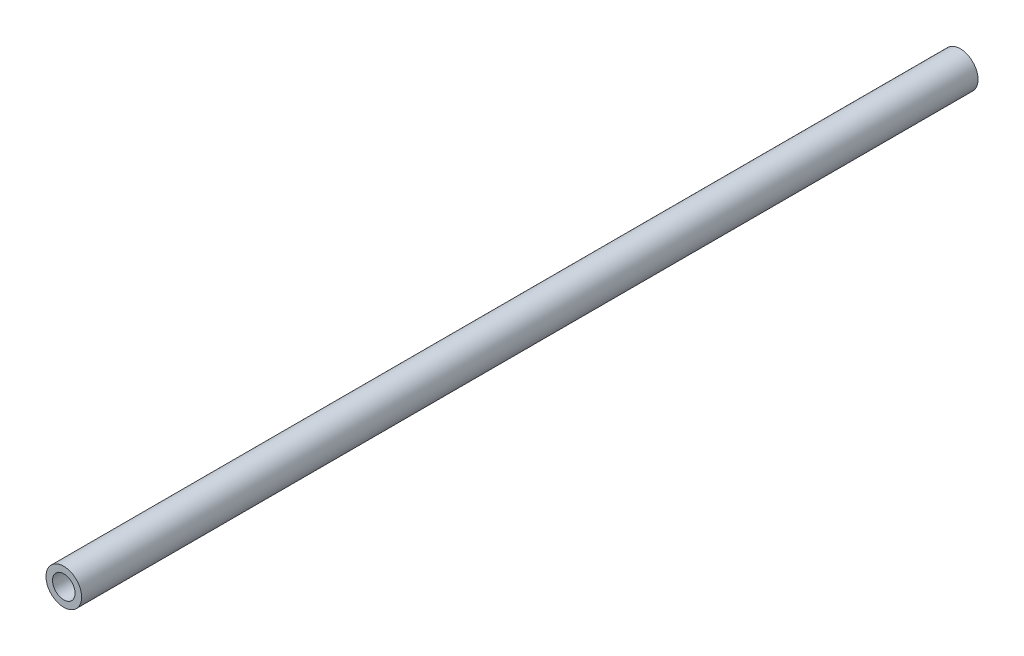
ISO-10303-21;
HEADER;
FILE_DESCRIPTION(('STEP AP214'),'2;1');
FILE_NAME('part.step','',(''),(''),'','','');
FILE_SCHEMA(('AUTOMOTIVE_DESIGN { 1 0 10303 214 1 1 1 1 }'));
ENDSEC;
DATA;
#1=APPLICATION_CONTEXT('core data for automotive mechanical design processes');
#2=APPLICATION_PROTOCOL_DEFINITION('international standard','automotive_design',2000,#1);
#3=PRODUCT_CONTEXT('',#1,'mechanical');
#4=PRODUCT('Part','Part','',(#3));
#5=PRODUCT_RELATED_PRODUCT_CATEGORY('part','',(#4));
#6=PRODUCT_DEFINITION_FORMATION('','',#4);
#7=PRODUCT_DEFINITION_CONTEXT('part definition',#1,'design');
#8=PRODUCT_DEFINITION('design','',#6,#7);
#9=PRODUCT_DEFINITION_SHAPE('','',#8);
#10=(LENGTH_UNIT() NAMED_UNIT(*) SI_UNIT(.MILLI.,.METRE.));
#11=(NAMED_UNIT(*) PLANE_ANGLE_UNIT() SI_UNIT($,.RADIAN.));
#12=(NAMED_UNIT(*) SI_UNIT($,.STERADIAN.) SOLID_ANGLE_UNIT());
#13=UNCERTAINTY_MEASURE_WITH_UNIT(LENGTH_MEASURE(1.E-05),#10,'distance_accuracy_value','');
#14=(GEOMETRIC_REPRESENTATION_CONTEXT(3) GLOBAL_UNCERTAINTY_ASSIGNED_CONTEXT((#13)) GLOBAL_UNIT_ASSIGNED_CONTEXT((#10,
#11,#12)) REPRESENTATION_CONTEXT('',''));
#15=CARTESIAN_POINT('',(0.,0.,0.));
#16=DIRECTION('',(0.,0.,1.));
#17=DIRECTION('',(1.,0.,0.));
#18=AXIS2_PLACEMENT_3D('',#15,#16,#17);
#19=CARTESIAN_POINT('',(0.,0.,120.));
#20=DIRECTION('',(0.,0.,1.));
#21=DIRECTION('',(1.,0.,0.));
#22=AXIS2_PLACEMENT_3D('',#19,#20,#21);
#23=PLANE('',#22);
#24=CARTESIAN_POINT('',(0.,0.,120.));
#25=DIRECTION('',(0.,0.,-1.));
#26=DIRECTION('',(-1.,0.,0.));
#27=AXIS2_PLACEMENT_3D('',#24,#25,#26);
#28=CIRCLE('',#27,1.5113);
#29=CARTESIAN_POINT('',(-1.5113,0.,120.));
#30=VERTEX_POINT('',#29);
#31=EDGE_CURVE('E11',#30,#30,#28,.T.);
#32=ORIENTED_EDGE('',*,*,#31,.T.);
#33=EDGE_LOOP('',(#32));
#34=FACE_BOUND('',#33,.T.);
#35=CARTESIAN_POINT('',(0.,0.,120.));
#36=DIRECTION('',(0.,0.,-1.));
#37=DIRECTION('',(-1.,0.,0.));
#38=AXIS2_PLACEMENT_3D('',#35,#36,#37);
#39=CIRCLE('',#38,2.38125);
#40=CARTESIAN_POINT('',(-2.38125,0.,120.));
#41=VERTEX_POINT('',#40);
#42=EDGE_CURVE('E51',#41,#41,#39,.T.);
#43=ORIENTED_EDGE('',*,*,#42,.F.);
#44=EDGE_LOOP('',(#43));
#45=FACE_BOUND('',#44,.T.);
#46=ADVANCED_FACE('F40',(#34,#45),#23,.T.);
#47=CARTESIAN_POINT('',(0.,0.,0.));
#48=DIRECTION('',(0.,0.,1.));
#49=DIRECTION('',(1.,0.,0.));
#50=AXIS2_PLACEMENT_3D('',#47,#48,#49);
#51=PLANE('',#50);
#52=CARTESIAN_POINT('',(0.,0.,0.));
#53=DIRECTION('',(0.,0.,-1.));
#54=DIRECTION('',(-1.,0.,0.));
#55=AXIS2_PLACEMENT_3D('',#52,#53,#54);
#56=CIRCLE('',#55,1.5113);
#57=CARTESIAN_POINT('',(-1.5113,0.,0.));
#58=VERTEX_POINT('',#57);
#59=EDGE_CURVE('E43',#58,#58,#56,.T.);
#60=ORIENTED_EDGE('',*,*,#59,.F.);
#61=EDGE_LOOP('',(#60));
#62=FACE_BOUND('',#61,.T.);
#63=CARTESIAN_POINT('',(0.,0.,0.));
#64=DIRECTION('',(0.,0.,-1.));
#65=DIRECTION('',(-1.,0.,0.));
#66=AXIS2_PLACEMENT_3D('',#63,#64,#65);
#67=CIRCLE('',#66,2.38125);
#68=CARTESIAN_POINT('',(-2.38125,0.,0.));
#69=VERTEX_POINT('',#68);
#70=EDGE_CURVE('E53',#69,#69,#67,.T.);
#71=ORIENTED_EDGE('',*,*,#70,.T.);
#72=EDGE_LOOP('',(#71));
#73=FACE_BOUND('',#72,.T.);
#74=ADVANCED_FACE('F64',(#62,#73),#51,.F.);
#75=CARTESIAN_POINT('',(0.,0.,120.));
#76=DIRECTION('',(0.,0.,-1.));
#77=DIRECTION('',(-1.,0.,0.));
#78=AXIS2_PLACEMENT_3D('',#75,#76,#77);
#79=CYLINDRICAL_SURFACE('',#78,1.5113);
#80=ORIENTED_EDGE('',*,*,#31,.F.);
#81=EDGE_LOOP('',(#80));
#82=FACE_BOUND('',#81,.T.);
#83=ORIENTED_EDGE('',*,*,#59,.T.);
#84=EDGE_LOOP('',(#83));
#85=FACE_BOUND('',#84,.T.);
#86=ADVANCED_FACE('F68',(#82,#85),#79,.F.);
#87=CARTESIAN_POINT('',(0.,0.,120.));
#88=DIRECTION('',(0.,0.,-1.));
#89=DIRECTION('',(-1.,0.,0.));
#90=AXIS2_PLACEMENT_3D('',#87,#88,#89);
#91=CYLINDRICAL_SURFACE('',#90,2.38125);
#92=ORIENTED_EDGE('',*,*,#42,.T.);
#93=EDGE_LOOP('',(#92));
#94=FACE_BOUND('',#93,.T.);
#95=ORIENTED_EDGE('',*,*,#70,.F.);
#96=EDGE_LOOP('',(#95));
#97=FACE_BOUND('',#96,.T.);
#98=ADVANCED_FACE('F60',(#94,#97),#91,.T.);
#99=CLOSED_SHELL('',(#46,#74,#86,#98));
#100=MANIFOLD_SOLID_BREP('B2',#99);
#101=ADVANCED_BREP_SHAPE_REPRESENTATION('',(#18,#100),#14);
#102=SHAPE_DEFINITION_REPRESENTATION(#9,#101);
ENDSEC;
END-ISO-10303-21;
